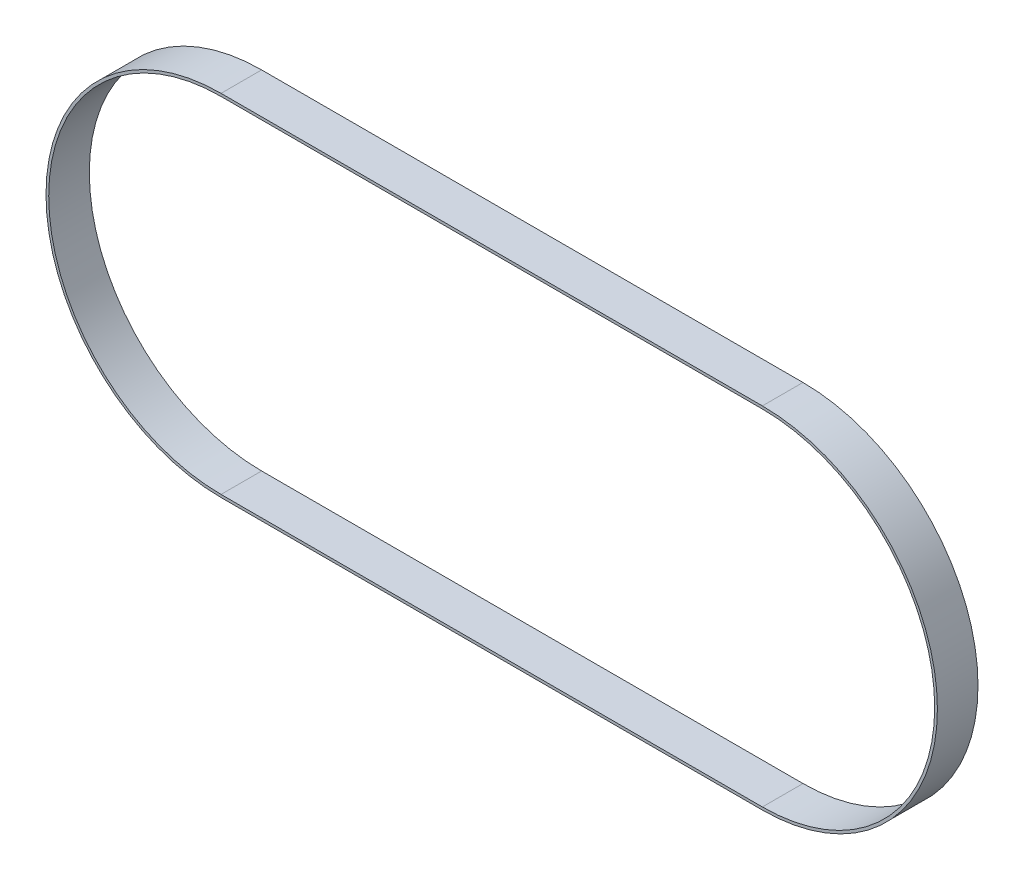
ISO-10303-21;
HEADER;
FILE_DESCRIPTION(('STEP AP214'),'2;1');
FILE_NAME('part.step','',(''),(''),'','','');
FILE_SCHEMA(('AUTOMOTIVE_DESIGN { 1 0 10303 214 1 1 1 1 }'));
ENDSEC;
DATA;
#1=APPLICATION_CONTEXT('core data for automotive mechanical design processes');
#2=APPLICATION_PROTOCOL_DEFINITION('international standard','automotive_design',2000,#1);
#3=PRODUCT_CONTEXT('',#1,'mechanical');
#4=PRODUCT('Part','Part','',(#3));
#5=PRODUCT_RELATED_PRODUCT_CATEGORY('part','',(#4));
#6=PRODUCT_DEFINITION_FORMATION('','',#4);
#7=PRODUCT_DEFINITION_CONTEXT('part definition',#1,'design');
#8=PRODUCT_DEFINITION('design','',#6,#7);
#9=PRODUCT_DEFINITION_SHAPE('','',#8);
#10=(LENGTH_UNIT() NAMED_UNIT(*) SI_UNIT(.MILLI.,.METRE.));
#11=(NAMED_UNIT(*) PLANE_ANGLE_UNIT() SI_UNIT($,.RADIAN.));
#12=(NAMED_UNIT(*) SI_UNIT($,.STERADIAN.) SOLID_ANGLE_UNIT());
#13=UNCERTAINTY_MEASURE_WITH_UNIT(LENGTH_MEASURE(1.E-05),#10,'distance_accuracy_value','');
#14=(GEOMETRIC_REPRESENTATION_CONTEXT(3) GLOBAL_UNCERTAINTY_ASSIGNED_CONTEXT((#13)) GLOBAL_UNIT_ASSIGNED_CONTEXT((#10,
#11,#12)) REPRESENTATION_CONTEXT('',''));
#15=CARTESIAN_POINT('',(0.,0.,0.));
#16=DIRECTION('',(0.,0.,1.));
#17=DIRECTION('',(1.,0.,0.));
#18=AXIS2_PLACEMENT_3D('',#15,#16,#17);
#19=CARTESIAN_POINT('',(-100.,0.,15.));
#20=DIRECTION('',(0.,0.,1.));
#21=DIRECTION('',(1.,0.,0.));
#22=AXIS2_PLACEMENT_3D('',#19,#20,#21);
#23=PLANE('',#22);
#24=CARTESIAN_POINT('',(-100.,0.,15.));
#25=DIRECTION('',(0.,0.,1.));
#26=DIRECTION('',(1.,0.,0.));
#27=AXIS2_PLACEMENT_3D('',#24,#25,#26);
#28=CIRCLE('',#27,64.6619772367581);
#29=CARTESIAN_POINT('',(-100.,64.6619772367581,15.));
#30=VERTEX_POINT('',#29);
#31=CARTESIAN_POINT('',(-100.,-64.6619772367581,15.));
#32=VERTEX_POINT('',#31);
#33=EDGE_CURVE('E135',#30,#32,#28,.T.);
#34=ORIENTED_EDGE('',*,*,#33,.T.);
#35=DIRECTION('',(1.,0.,0.));
#36=VECTOR('',#35,1.);
#37=CARTESIAN_POINT('',(-100.,-64.6619772367581,15.));
#38=LINE('',#37,#36);
#39=CARTESIAN_POINT('',(100.,-64.6619772367581,15.));
#40=VERTEX_POINT('',#39);
#41=EDGE_CURVE('E138',#32,#40,#38,.T.);
#42=ORIENTED_EDGE('',*,*,#41,.T.);
#43=CARTESIAN_POINT('',(100.,0.,15.));
#44=DIRECTION('',(0.,0.,1.));
#45=DIRECTION('',(1.,0.,0.));
#46=AXIS2_PLACEMENT_3D('',#43,#44,#45);
#47=CIRCLE('',#46,64.6619772367581);
#48=CARTESIAN_POINT('',(100.,64.6619772367581,15.));
#49=VERTEX_POINT('',#48);
#50=EDGE_CURVE('E141',#40,#49,#47,.T.);
#51=ORIENTED_EDGE('',*,*,#50,.T.);
#52=DIRECTION('',(-1.,0.,0.));
#53=VECTOR('',#52,1.);
#54=CARTESIAN_POINT('',(-100.,64.6619772367581,15.));
#55=LINE('',#54,#53);
#56=EDGE_CURVE('E143',#49,#30,#55,.T.);
#57=ORIENTED_EDGE('',*,*,#56,.T.);
#58=EDGE_LOOP('',(#34,#42,#51,#57));
#59=FACE_BOUND('',#58,.T.);
#60=DIRECTION('',(1.,0.,0.));
#61=VECTOR('',#60,1.);
#62=CARTESIAN_POINT('',(-100.,-63.6619772367581,15.));
#63=LINE('',#62,#61);
#64=CARTESIAN_POINT('',(-100.,-63.6619772367581,15.));
#65=VERTEX_POINT('',#64);
#66=CARTESIAN_POINT('',(100.,-63.6619772367581,15.));
#67=VERTEX_POINT('',#66);
#68=EDGE_CURVE('E107',#65,#67,#63,.T.);
#69=ORIENTED_EDGE('',*,*,#68,.F.);
#70=CARTESIAN_POINT('',(-100.,0.,15.));
#71=DIRECTION('',(0.,0.,1.));
#72=DIRECTION('',(1.,0.,0.));
#73=AXIS2_PLACEMENT_3D('',#70,#71,#72);
#74=CIRCLE('',#73,63.6619772367581);
#75=CARTESIAN_POINT('',(-100.,63.6619772367581,15.));
#76=VERTEX_POINT('',#75);
#77=EDGE_CURVE('E99',#76,#65,#74,.T.);
#78=ORIENTED_EDGE('',*,*,#77,.F.);
#79=DIRECTION('',(-1.,0.,0.));
#80=VECTOR('',#79,1.);
#81=CARTESIAN_POINT('',(-100.,63.6619772367581,15.));
#82=LINE('',#81,#80);
#83=CARTESIAN_POINT('',(100.,63.6619772367581,15.));
#84=VERTEX_POINT('',#83);
#85=EDGE_CURVE('E121',#84,#76,#82,.T.);
#86=ORIENTED_EDGE('',*,*,#85,.F.);
#87=CARTESIAN_POINT('',(100.,0.,15.));
#88=DIRECTION('',(0.,0.,1.));
#89=DIRECTION('',(1.,0.,0.));
#90=AXIS2_PLACEMENT_3D('',#87,#88,#89);
#91=CIRCLE('',#90,63.6619772367581);
#92=EDGE_CURVE('E119',#67,#84,#91,.T.);
#93=ORIENTED_EDGE('',*,*,#92,.F.);
#94=EDGE_LOOP('',(#69,#78,#86,#93));
#95=FACE_BOUND('',#94,.T.);
#96=ADVANCED_FACE('F34',(#59,#95),#23,.T.);
#97=CARTESIAN_POINT('',(-100.,0.,0.));
#98=DIRECTION('',(0.,0.,1.));
#99=DIRECTION('',(1.,0.,0.));
#100=AXIS2_PLACEMENT_3D('',#97,#98,#99);
#101=PLANE('',#100);
#102=CARTESIAN_POINT('',(-100.,0.,0.));
#103=DIRECTION('',(0.,0.,1.));
#104=DIRECTION('',(1.,0.,0.));
#105=AXIS2_PLACEMENT_3D('',#102,#103,#104);
#106=CIRCLE('',#105,64.6619772367581);
#107=CARTESIAN_POINT('',(-100.,64.6619772367581,0.));
#108=VERTEX_POINT('',#107);
#109=CARTESIAN_POINT('',(-100.,-64.6619772367581,0.));
#110=VERTEX_POINT('',#109);
#111=EDGE_CURVE('E115',#108,#110,#106,.T.);
#112=ORIENTED_EDGE('',*,*,#111,.F.);
#113=DIRECTION('',(-1.,0.,0.));
#114=VECTOR('',#113,1.);
#115=CARTESIAN_POINT('',(-100.,64.6619772367581,0.));
#116=LINE('',#115,#114);
#117=CARTESIAN_POINT('',(100.,64.6619772367581,0.));
#118=VERTEX_POINT('',#117);
#119=EDGE_CURVE('E139',#118,#108,#116,.T.);
#120=ORIENTED_EDGE('',*,*,#119,.F.);
#121=CARTESIAN_POINT('',(100.,0.,0.));
#122=DIRECTION('',(0.,0.,1.));
#123=DIRECTION('',(1.,0.,0.));
#124=AXIS2_PLACEMENT_3D('',#121,#122,#123);
#125=CIRCLE('',#124,64.6619772367581);
#126=CARTESIAN_POINT('',(100.,-64.6619772367581,0.));
#127=VERTEX_POINT('',#126);
#128=EDGE_CURVE('E150',#127,#118,#125,.T.);
#129=ORIENTED_EDGE('',*,*,#128,.F.);
#130=DIRECTION('',(1.,0.,0.));
#131=VECTOR('',#130,1.);
#132=CARTESIAN_POINT('',(-100.,-64.6619772367581,0.));
#133=LINE('',#132,#131);
#134=EDGE_CURVE('E148',#110,#127,#133,.T.);
#135=ORIENTED_EDGE('',*,*,#134,.F.);
#136=EDGE_LOOP('',(#112,#120,#129,#135));
#137=FACE_BOUND('',#136,.T.);
#138=CARTESIAN_POINT('',(-100.,0.,0.));
#139=DIRECTION('',(0.,0.,1.));
#140=DIRECTION('',(1.,0.,0.));
#141=AXIS2_PLACEMENT_3D('',#138,#139,#140);
#142=CIRCLE('',#141,63.6619772367581);
#143=CARTESIAN_POINT('',(-100.,63.6619772367581,0.));
#144=VERTEX_POINT('',#143);
#145=CARTESIAN_POINT('',(-100.,-63.6619772367581,0.));
#146=VERTEX_POINT('',#145);
#147=EDGE_CURVE('E57',#144,#146,#142,.T.);
#148=ORIENTED_EDGE('',*,*,#147,.T.);
#149=DIRECTION('',(1.,0.,0.));
#150=VECTOR('',#149,1.);
#151=CARTESIAN_POINT('',(-100.,-63.6619772367581,0.));
#152=LINE('',#151,#150);
#153=CARTESIAN_POINT('',(100.,-63.6619772367581,0.));
#154=VERTEX_POINT('',#153);
#155=EDGE_CURVE('E114',#146,#154,#152,.T.);
#156=ORIENTED_EDGE('',*,*,#155,.T.);
#157=CARTESIAN_POINT('',(100.,0.,0.));
#158=DIRECTION('',(0.,0.,1.));
#159=DIRECTION('',(1.,0.,0.));
#160=AXIS2_PLACEMENT_3D('',#157,#158,#159);
#161=CIRCLE('',#160,63.6619772367581);
#162=CARTESIAN_POINT('',(100.,63.6619772367581,0.));
#163=VERTEX_POINT('',#162);
#164=EDGE_CURVE('E127',#154,#163,#161,.T.);
#165=ORIENTED_EDGE('',*,*,#164,.T.);
#166=DIRECTION('',(-1.,0.,0.));
#167=VECTOR('',#166,1.);
#168=CARTESIAN_POINT('',(-100.,63.6619772367581,0.));
#169=LINE('',#168,#167);
#170=EDGE_CURVE('E108',#163,#144,#169,.T.);
#171=ORIENTED_EDGE('',*,*,#170,.T.);
#172=EDGE_LOOP('',(#148,#156,#165,#171));
#173=FACE_BOUND('',#172,.T.);
#174=ADVANCED_FACE('F168',(#137,#173),#101,.F.);
#175=CARTESIAN_POINT('',(-100.,0.,15.));
#176=DIRECTION('',(0.,0.,-1.));
#177=DIRECTION('',(-1.,0.,0.));
#178=AXIS2_PLACEMENT_3D('',#175,#176,#177);
#179=CYLINDRICAL_SURFACE('',#178,64.6619772367581);
#180=ORIENTED_EDGE('',*,*,#111,.T.);
#181=DIRECTION('',(0.,0.,-1.));
#182=VECTOR('',#181,1.);
#183=CARTESIAN_POINT('',(-100.,-64.6619772367581,15.));
#184=LINE('',#183,#182);
#185=EDGE_CURVE('E11',#32,#110,#184,.T.);
#186=ORIENTED_EDGE('',*,*,#185,.F.);
#187=ORIENTED_EDGE('',*,*,#33,.F.);
#188=DIRECTION('',(0.,0.,-1.));
#189=VECTOR('',#188,1.);
#190=CARTESIAN_POINT('',(-100.,64.6619772367581,15.));
#191=LINE('',#190,#189);
#192=EDGE_CURVE('E145',#30,#108,#191,.T.);
#193=ORIENTED_EDGE('',*,*,#192,.T.);
#194=EDGE_LOOP('',(#180,#186,#187,#193));
#195=FACE_BOUND('',#194,.T.);
#196=ADVANCED_FACE('F36',(#195),#179,.T.);
#197=CARTESIAN_POINT('',(-100.,-64.6619772367581,15.));
#198=DIRECTION('',(0.,1.,0.));
#199=DIRECTION('',(-1.,0.,0.));
#200=AXIS2_PLACEMENT_3D('',#197,#198,#199);
#201=PLANE('',#200);
#202=ORIENTED_EDGE('',*,*,#134,.T.);
#203=DIRECTION('',(0.,0.,-1.));
#204=VECTOR('',#203,1.);
#205=CARTESIAN_POINT('',(100.,-64.6619772367581,15.));
#206=LINE('',#205,#204);
#207=EDGE_CURVE('E42',#40,#127,#206,.T.);
#208=ORIENTED_EDGE('',*,*,#207,.F.);
#209=ORIENTED_EDGE('',*,*,#41,.F.);
#210=ORIENTED_EDGE('',*,*,#185,.T.);
#211=EDGE_LOOP('',(#202,#208,#209,#210));
#212=FACE_BOUND('',#211,.T.);
#213=ADVANCED_FACE('F178',(#212),#201,.F.);
#214=CARTESIAN_POINT('',(100.,0.,15.));
#215=DIRECTION('',(0.,0.,-1.));
#216=DIRECTION('',(-1.,0.,0.));
#217=AXIS2_PLACEMENT_3D('',#214,#215,#216);
#218=CYLINDRICAL_SURFACE('',#217,64.6619772367581);
#219=ORIENTED_EDGE('',*,*,#128,.T.);
#220=DIRECTION('',(0.,0.,-1.));
#221=VECTOR('',#220,1.);
#222=CARTESIAN_POINT('',(100.,64.6619772367581,15.));
#223=LINE('',#222,#221);
#224=EDGE_CURVE('E155',#49,#118,#223,.T.);
#225=ORIENTED_EDGE('',*,*,#224,.F.);
#226=ORIENTED_EDGE('',*,*,#50,.F.);
#227=ORIENTED_EDGE('',*,*,#207,.T.);
#228=EDGE_LOOP('',(#219,#225,#226,#227));
#229=FACE_BOUND('',#228,.T.);
#230=ADVANCED_FACE('F162',(#229),#218,.T.);
#231=CARTESIAN_POINT('',(-100.,64.6619772367581,15.));
#232=DIRECTION('',(0.,-1.,0.));
#233=DIRECTION('',(0.,0.,-1.));
#234=AXIS2_PLACEMENT_3D('',#231,#232,#233);
#235=PLANE('',#234);
#236=ORIENTED_EDGE('',*,*,#119,.T.);
#237=ORIENTED_EDGE('',*,*,#192,.F.);
#238=ORIENTED_EDGE('',*,*,#56,.F.);
#239=ORIENTED_EDGE('',*,*,#224,.T.);
#240=EDGE_LOOP('',(#236,#237,#238,#239));
#241=FACE_BOUND('',#240,.T.);
#242=ADVANCED_FACE('F172',(#241),#235,.F.);
#243=CARTESIAN_POINT('',(-100.,0.,15.));
#244=DIRECTION('',(0.,0.,-1.));
#245=DIRECTION('',(-1.,0.,0.));
#246=AXIS2_PLACEMENT_3D('',#243,#244,#245);
#247=CYLINDRICAL_SURFACE('',#246,63.6619772367581);
#248=ORIENTED_EDGE('',*,*,#147,.F.);
#249=DIRECTION('',(0.,0.,-1.));
#250=VECTOR('',#249,1.);
#251=CARTESIAN_POINT('',(-100.,63.6619772367581,15.));
#252=LINE('',#251,#250);
#253=EDGE_CURVE('E103',#76,#144,#252,.T.);
#254=ORIENTED_EDGE('',*,*,#253,.F.);
#255=ORIENTED_EDGE('',*,*,#77,.T.);
#256=DIRECTION('',(0.,0.,-1.));
#257=VECTOR('',#256,1.);
#258=CARTESIAN_POINT('',(-100.,-63.6619772367581,15.));
#259=LINE('',#258,#257);
#260=EDGE_CURVE('E102',#65,#146,#259,.T.);
#261=ORIENTED_EDGE('',*,*,#260,.T.);
#262=EDGE_LOOP('',(#248,#254,#255,#261));
#263=FACE_BOUND('',#262,.T.);
#264=ADVANCED_FACE('F101',(#263),#247,.F.);
#265=CARTESIAN_POINT('',(-100.,-63.6619772367581,15.));
#266=DIRECTION('',(0.,1.,0.));
#267=DIRECTION('',(0.,0.,1.));
#268=AXIS2_PLACEMENT_3D('',#265,#266,#267);
#269=PLANE('',#268);
#270=ORIENTED_EDGE('',*,*,#155,.F.);
#271=ORIENTED_EDGE('',*,*,#260,.F.);
#272=ORIENTED_EDGE('',*,*,#68,.T.);
#273=DIRECTION('',(0.,0.,-1.));
#274=VECTOR('',#273,1.);
#275=CARTESIAN_POINT('',(100.,-63.6619772367581,15.));
#276=LINE('',#275,#274);
#277=EDGE_CURVE('E116',#67,#154,#276,.T.);
#278=ORIENTED_EDGE('',*,*,#277,.T.);
#279=EDGE_LOOP('',(#270,#271,#272,#278));
#280=FACE_BOUND('',#279,.T.);
#281=ADVANCED_FACE('F111',(#280),#269,.T.);
#282=CARTESIAN_POINT('',(100.,0.,15.));
#283=DIRECTION('',(0.,0.,-1.));
#284=DIRECTION('',(-1.,0.,0.));
#285=AXIS2_PLACEMENT_3D('',#282,#283,#284);
#286=CYLINDRICAL_SURFACE('',#285,63.6619772367581);
#287=ORIENTED_EDGE('',*,*,#164,.F.);
#288=ORIENTED_EDGE('',*,*,#277,.F.);
#289=ORIENTED_EDGE('',*,*,#92,.T.);
#290=DIRECTION('',(0.,0.,-1.));
#291=VECTOR('',#290,1.);
#292=CARTESIAN_POINT('',(100.,63.6619772367581,15.));
#293=LINE('',#292,#291);
#294=EDGE_CURVE('E49',#84,#163,#293,.T.);
#295=ORIENTED_EDGE('',*,*,#294,.T.);
#296=EDGE_LOOP('',(#287,#288,#289,#295));
#297=FACE_BOUND('',#296,.T.);
#298=ADVANCED_FACE('F201',(#297),#286,.F.);
#299=CARTESIAN_POINT('',(-100.,63.6619772367581,15.));
#300=DIRECTION('',(0.,-1.,0.));
#301=DIRECTION('',(0.,0.,-1.));
#302=AXIS2_PLACEMENT_3D('',#299,#300,#301);
#303=PLANE('',#302);
#304=ORIENTED_EDGE('',*,*,#170,.F.);
#305=ORIENTED_EDGE('',*,*,#294,.F.);
#306=ORIENTED_EDGE('',*,*,#85,.T.);
#307=ORIENTED_EDGE('',*,*,#253,.T.);
#308=EDGE_LOOP('',(#304,#305,#306,#307));
#309=FACE_BOUND('',#308,.T.);
#310=ADVANCED_FACE('F205',(#309),#303,.T.);
#311=CLOSED_SHELL('',(#96,#174,#196,#213,#230,#242,#264,#281,#298,#310));
#312=MANIFOLD_SOLID_BREP('B2',#311);
#313=ADVANCED_BREP_SHAPE_REPRESENTATION('',(#18,#312),#14);
#314=SHAPE_DEFINITION_REPRESENTATION(#9,#313);
ENDSEC;
END-ISO-10303-21;
